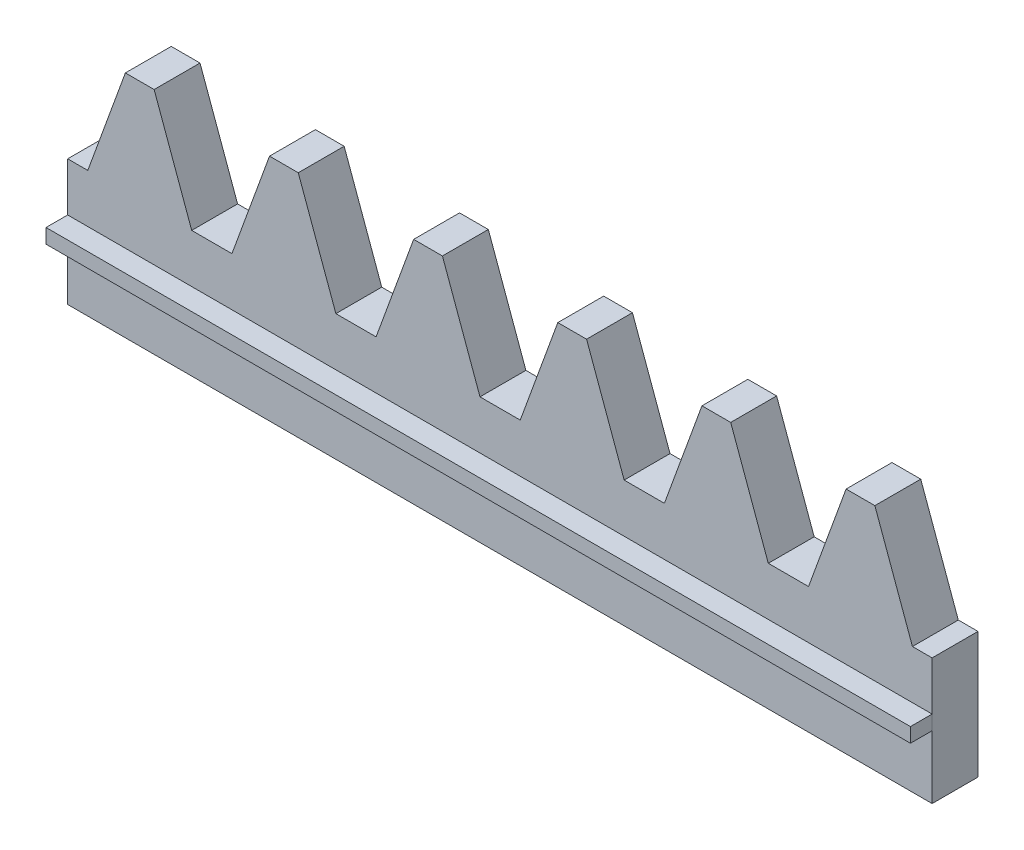
ISO-10303-21;
HEADER;
FILE_DESCRIPTION(('STEP AP214'),'2;1');
FILE_NAME('part.step','',(''),(''),'','','');
FILE_SCHEMA(('AUTOMOTIVE_DESIGN { 1 0 10303 214 1 1 1 1 }'));
ENDSEC;
DATA;
#1=APPLICATION_CONTEXT('core data for automotive mechanical design processes');
#2=APPLICATION_PROTOCOL_DEFINITION('international standard','automotive_design',2000,#1);
#3=PRODUCT_CONTEXT('',#1,'mechanical');
#4=PRODUCT('Part','Part','',(#3));
#5=PRODUCT_RELATED_PRODUCT_CATEGORY('part','',(#4));
#6=PRODUCT_DEFINITION_FORMATION('','',#4);
#7=PRODUCT_DEFINITION_CONTEXT('part definition',#1,'design');
#8=PRODUCT_DEFINITION('design','',#6,#7);
#9=PRODUCT_DEFINITION_SHAPE('','',#8);
#10=(LENGTH_UNIT() NAMED_UNIT(*) SI_UNIT(.MILLI.,.METRE.));
#11=(NAMED_UNIT(*) PLANE_ANGLE_UNIT() SI_UNIT($,.RADIAN.));
#12=(NAMED_UNIT(*) SI_UNIT($,.STERADIAN.) SOLID_ANGLE_UNIT());
#13=UNCERTAINTY_MEASURE_WITH_UNIT(LENGTH_MEASURE(1.E-05),#10,'distance_accuracy_value','');
#14=(GEOMETRIC_REPRESENTATION_CONTEXT(3) GLOBAL_UNCERTAINTY_ASSIGNED_CONTEXT((#13)) GLOBAL_UNIT_ASSIGNED_CONTEXT((#10,
#11,#12)) REPRESENTATION_CONTEXT('',''));
#15=CARTESIAN_POINT('',(0.,0.,0.));
#16=DIRECTION('',(0.,0.,1.));
#17=DIRECTION('',(1.,0.,0.));
#18=AXIS2_PLACEMENT_3D('',#15,#16,#17);
#19=CARTESIAN_POINT('',(-57.3240770108356,19.3978439460535,27.3611781399103));
#20=DIRECTION('',(1.,0.,0.));
#21=DIRECTION('',(0.,0.,-1.));
#22=AXIS2_PLACEMENT_3D('',#19,#20,#21);
#23=PLANE('',#22);
#24=DIRECTION('',(0.,-1.,0.));
#25=VECTOR('',#24,1.);
#26=CARTESIAN_POINT('',(-57.3240770108356,19.3978439460535,24.3611781399103));
#27=LINE('',#26,#25);
#28=CARTESIAN_POINT('',(-57.3240770108356,19.3978439460535,24.3611781399103));
#29=VERTEX_POINT('',#28);
#30=CARTESIAN_POINT('',(-57.3240770108356,17.3978439460535,24.3611781399103));
#31=VERTEX_POINT('',#30);
#32=EDGE_CURVE('E116',#29,#31,#27,.T.);
#33=ORIENTED_EDGE('',*,*,#32,.T.);
#34=DIRECTION('',(0.,0.,-1.));
#35=VECTOR('',#34,1.);
#36=CARTESIAN_POINT('',(-57.3240770108356,17.3978439460535,27.3611781399103));
#37=LINE('',#36,#35);
#38=CARTESIAN_POINT('',(-57.3240770108356,17.3978439460535,27.3611781399103));
#39=VERTEX_POINT('',#38);
#40=EDGE_CURVE('E12',#39,#31,#37,.T.);
#41=ORIENTED_EDGE('',*,*,#40,.F.);
#42=DIRECTION('',(0.,-1.,0.));
#43=VECTOR('',#42,1.);
#44=CARTESIAN_POINT('',(-57.3240770108356,19.3978439460535,27.3611781399103));
#45=LINE('',#44,#43);
#46=CARTESIAN_POINT('',(-57.3240770108356,19.3978439460535,27.3611781399103));
#47=VERTEX_POINT('',#46);
#48=EDGE_CURVE('E104',#47,#39,#45,.T.);
#49=ORIENTED_EDGE('',*,*,#48,.F.);
#50=DIRECTION('',(0.,0.,-1.));
#51=VECTOR('',#50,1.);
#52=CARTESIAN_POINT('',(-57.3240770108356,19.3978439460535,27.3611781399103));
#53=LINE('',#52,#51);
#54=EDGE_CURVE('E112',#47,#29,#53,.T.);
#55=ORIENTED_EDGE('',*,*,#54,.T.);
#56=EDGE_LOOP('',(#33,#41,#49,#55));
#57=FACE_BOUND('',#56,.T.);
#58=ADVANCED_FACE('F53',(#57),#23,.F.);
#59=CARTESIAN_POINT('',(-57.3240770108356,17.3978439460535,27.3611781399103));
#60=DIRECTION('',(0.,1.,0.));
#61=DIRECTION('',(0.,0.,1.));
#62=AXIS2_PLACEMENT_3D('',#59,#60,#61);
#63=PLANE('',#62);
#64=DIRECTION('',(1.,0.,0.));
#65=VECTOR('',#64,1.);
#66=CARTESIAN_POINT('',(-57.3240770108356,17.3978439460535,24.3611781399103));
#67=LINE('',#66,#65);
#68=CARTESIAN_POINT('',(62.3099229891644,17.3978439460535,24.3611781399103));
#69=VERTEX_POINT('',#68);
#70=EDGE_CURVE('E108',#31,#69,#67,.T.);
#71=ORIENTED_EDGE('',*,*,#70,.T.);
#72=DIRECTION('',(0.,0.,-1.));
#73=VECTOR('',#72,1.);
#74=CARTESIAN_POINT('',(62.3099229891644,17.3978439460535,27.3611781399103));
#75=LINE('',#74,#73);
#76=CARTESIAN_POINT('',(62.3099229891644,17.3978439460535,27.3611781399103));
#77=VERTEX_POINT('',#76);
#78=EDGE_CURVE('E61',#77,#69,#75,.T.);
#79=ORIENTED_EDGE('',*,*,#78,.F.);
#80=DIRECTION('',(1.,0.,0.));
#81=VECTOR('',#80,1.);
#82=CARTESIAN_POINT('',(-57.3240770108356,17.3978439460535,27.3611781399103));
#83=LINE('',#82,#81);
#84=EDGE_CURVE('E99',#39,#77,#83,.T.);
#85=ORIENTED_EDGE('',*,*,#84,.F.);
#86=ORIENTED_EDGE('',*,*,#40,.T.);
#87=EDGE_LOOP('',(#71,#79,#85,#86));
#88=FACE_BOUND('',#87,.T.);
#89=ADVANCED_FACE('F107',(#88),#63,.F.);
#90=CARTESIAN_POINT('',(62.3099229891644,19.3978439460535,27.3611781399103));
#91=DIRECTION('',(-1.,0.,0.));
#92=DIRECTION('',(0.,0.,1.));
#93=AXIS2_PLACEMENT_3D('',#90,#91,#92);
#94=PLANE('',#93);
#95=DIRECTION('',(0.,1.,0.));
#96=VECTOR('',#95,1.);
#97=CARTESIAN_POINT('',(62.3099229891644,19.3978439460535,24.3611781399103));
#98=LINE('',#97,#96);
#99=CARTESIAN_POINT('',(62.3099229891644,19.3978439460535,24.3611781399103));
#100=VERTEX_POINT('',#99);
#101=EDGE_CURVE('E86',#69,#100,#98,.T.);
#102=ORIENTED_EDGE('',*,*,#101,.T.);
#103=DIRECTION('',(0.,0.,-1.));
#104=VECTOR('',#103,1.);
#105=CARTESIAN_POINT('',(62.3099229891644,19.3978439460535,27.3611781399103));
#106=LINE('',#105,#104);
#107=CARTESIAN_POINT('',(62.3099229891644,19.3978439460535,27.3611781399103));
#108=VERTEX_POINT('',#107);
#109=EDGE_CURVE('E109',#108,#100,#106,.T.);
#110=ORIENTED_EDGE('',*,*,#109,.F.);
#111=DIRECTION('',(0.,1.,0.));
#112=VECTOR('',#111,1.);
#113=CARTESIAN_POINT('',(62.3099229891644,19.3978439460535,27.3611781399103));
#114=LINE('',#113,#112);
#115=EDGE_CURVE('E102',#77,#108,#114,.T.);
#116=ORIENTED_EDGE('',*,*,#115,.F.);
#117=ORIENTED_EDGE('',*,*,#78,.T.);
#118=EDGE_LOOP('',(#102,#110,#116,#117));
#119=FACE_BOUND('',#118,.T.);
#120=ADVANCED_FACE('F110',(#119),#94,.F.);
#121=CARTESIAN_POINT('',(-57.3240770108356,19.3978439460535,27.3611781399103));
#122=DIRECTION('',(0.,-1.,0.));
#123=DIRECTION('',(0.,0.,-1.));
#124=AXIS2_PLACEMENT_3D('',#121,#122,#123);
#125=PLANE('',#124);
#126=DIRECTION('',(-1.,0.,0.));
#127=VECTOR('',#126,1.);
#128=CARTESIAN_POINT('',(-57.3240770108356,19.3978439460535,24.3611781399103));
#129=LINE('',#128,#127);
#130=EDGE_CURVE('E92',#100,#29,#129,.T.);
#131=ORIENTED_EDGE('',*,*,#130,.T.);
#132=ORIENTED_EDGE('',*,*,#54,.F.);
#133=DIRECTION('',(-1.,0.,0.));
#134=VECTOR('',#133,1.);
#135=CARTESIAN_POINT('',(-57.3240770108356,19.3978439460535,27.3611781399103));
#136=LINE('',#135,#134);
#137=EDGE_CURVE('E69',#108,#47,#136,.T.);
#138=ORIENTED_EDGE('',*,*,#137,.F.);
#139=ORIENTED_EDGE('',*,*,#109,.T.);
#140=EDGE_LOOP('',(#131,#132,#138,#139));
#141=FACE_BOUND('',#140,.T.);
#142=ADVANCED_FACE('F123',(#141),#125,.F.);
#143=CARTESIAN_POINT('',(0.,0.,27.3611781399103));
#144=DIRECTION('',(0.,0.,1.));
#145=DIRECTION('',(1.,0.,0.));
#146=AXIS2_PLACEMENT_3D('',#143,#144,#145);
#147=PLANE('',#146);
#148=ORIENTED_EDGE('',*,*,#48,.T.);
#149=ORIENTED_EDGE('',*,*,#84,.T.);
#150=ORIENTED_EDGE('',*,*,#115,.T.);
#151=ORIENTED_EDGE('',*,*,#137,.T.);
#152=EDGE_LOOP('',(#148,#149,#150,#151));
#153=FACE_BOUND('',#152,.T.);
#154=ADVANCED_FACE('F100',(#153),#147,.T.);
#155=CARTESIAN_POINT('',(0.,0.,24.3611781399103));
#156=DIRECTION('',(0.,0.,1.));
#157=DIRECTION('',(1.,0.,0.));
#158=AXIS2_PLACEMENT_3D('',#155,#156,#157);
#159=PLANE('',#158);
#160=ORIENTED_EDGE('',*,*,#32,.F.);
#161=ORIENTED_EDGE('',*,*,#130,.F.);
#162=ORIENTED_EDGE('',*,*,#101,.F.);
#163=ORIENTED_EDGE('',*,*,#70,.F.);
#164=EDGE_LOOP('',(#160,#161,#162,#163));
#165=FACE_BOUND('',#164,.T.);
#166=ADVANCED_FACE('F126',(#165),#159,.F.);
#167=CLOSED_SHELL('',(#58,#89,#120,#142,#154,#166));
#168=MANIFOLD_SOLID_BREP('B2',#167);
#169=CARTESIAN_POINT('',(-57.3240770108356,40.4165939460293,18.0111781399103));
#170=DIRECTION('',(0.,1.,0.));
#171=DIRECTION('',(0.,0.,1.));
#172=AXIS2_PLACEMENT_3D('',#169,#170,#171);
#173=PLANE('',#172);
#174=DIRECTION('',(0.,0.,1.));
#175=VECTOR('',#174,1.);
#176=CARTESIAN_POINT('',(34.4372003069818,40.4165939460293,18.0111781399103));
#177=LINE('',#176,#175);
#178=CARTESIAN_POINT('',(34.4372003069818,40.4165939460293,18.0111781399103));
#179=VERTEX_POINT('',#178);
#180=CARTESIAN_POINT('',(34.4372003069818,40.4165939460293,24.3611781399103));
#181=VERTEX_POINT('',#180);
#182=EDGE_CURVE('E406',#179,#181,#177,.T.);
#183=ORIENTED_EDGE('',*,*,#182,.F.);
#184=DIRECTION('',(-1.,0.,0.));
#185=VECTOR('',#184,1.);
#186=CARTESIAN_POINT('',(-57.3240770108356,40.4165939460293,18.0111781399103));
#187=LINE('',#186,#185);
#188=CARTESIAN_POINT('',(30.4566656184251,40.4165939460293,18.0111781399103));
#189=VERTEX_POINT('',#188);
#190=EDGE_CURVE('E533',#179,#189,#187,.T.);
#191=ORIENTED_EDGE('',*,*,#190,.T.);
#192=DIRECTION('',(0.,0.,-1.));
#193=VECTOR('',#192,1.);
#194=CARTESIAN_POINT('',(30.4566656184251,40.4165939460293,18.0111781399103));
#195=LINE('',#194,#193);
#196=CARTESIAN_POINT('',(30.4566656184251,40.4165939460293,24.3611781399103));
#197=VERTEX_POINT('',#196);
#198=EDGE_CURVE('E426',#197,#189,#195,.T.);
#199=ORIENTED_EDGE('',*,*,#198,.F.);
#200=DIRECTION('',(-1.,0.,0.));
#201=VECTOR('',#200,1.);
#202=CARTESIAN_POINT('',(-57.3240770108356,40.4165939460293,24.3611781399103));
#203=LINE('',#202,#201);
#204=EDGE_CURVE('E543',#181,#197,#203,.T.);
#205=ORIENTED_EDGE('',*,*,#204,.F.);
#206=EDGE_LOOP('',(#183,#191,#199,#205));
#207=FACE_BOUND('',#206,.T.);
#208=ADVANCED_FACE('F177',(#207),#173,.T.);
#209=DIRECTION('',(0.,0.,1.));
#210=VECTOR('',#209,1.);
#211=CARTESIAN_POINT('',(14.4880869795287,40.4165939460293,18.0111781399103));
#212=LINE('',#211,#210);
#213=CARTESIAN_POINT('',(14.4880869795287,40.4165939460293,18.0111781399103));
#214=VERTEX_POINT('',#213);
#215=CARTESIAN_POINT('',(14.4880869795287,40.4165939460293,24.3611781399103));
#216=VERTEX_POINT('',#215);
#217=EDGE_CURVE('E430',#214,#216,#212,.T.);
#218=ORIENTED_EDGE('',*,*,#217,.F.);
#219=CARTESIAN_POINT('',(10.507552290972,40.4165939460293,18.0111781399103));
#220=VERTEX_POINT('',#219);
#221=EDGE_CURVE('E601',#214,#220,#187,.T.);
#222=ORIENTED_EDGE('',*,*,#221,.T.);
#223=DIRECTION('',(0.,0.,-1.));
#224=VECTOR('',#223,1.);
#225=CARTESIAN_POINT('',(10.507552290972,40.4165939460293,18.0111781399103));
#226=LINE('',#225,#224);
#227=CARTESIAN_POINT('',(10.507552290972,40.4165939460293,24.3611781399103));
#228=VERTEX_POINT('',#227);
#229=EDGE_CURVE('E450',#228,#220,#226,.T.);
#230=ORIENTED_EDGE('',*,*,#229,.F.);
#231=EDGE_CURVE('E574',#216,#228,#203,.T.);
#232=ORIENTED_EDGE('',*,*,#231,.F.);
#233=EDGE_LOOP('',(#218,#222,#230,#232));
#234=FACE_BOUND('',#233,.T.);
#235=ADVANCED_FACE('F619',(#234),#173,.T.);
#236=DIRECTION('',(0.,0.,1.));
#237=VECTOR('',#236,1.);
#238=CARTESIAN_POINT('',(-5.46102634792439,40.4165939460293,18.0111781399103));
#239=LINE('',#238,#237);
#240=CARTESIAN_POINT('',(-5.46102634792439,40.4165939460293,18.0111781399103));
#241=VERTEX_POINT('',#240);
#242=CARTESIAN_POINT('',(-5.46102634792439,40.4165939460293,24.3611781399103));
#243=VERTEX_POINT('',#242);
#244=EDGE_CURVE('E454',#241,#243,#239,.T.);
#245=ORIENTED_EDGE('',*,*,#244,.F.);
#246=CARTESIAN_POINT('',(-9.44156103648114,40.4165939460293,18.0111781399103));
#247=VERTEX_POINT('',#246);
#248=EDGE_CURVE('E596',#241,#247,#187,.T.);
#249=ORIENTED_EDGE('',*,*,#248,.T.);
#250=DIRECTION('',(0.,0.,-1.));
#251=VECTOR('',#250,1.);
#252=CARTESIAN_POINT('',(-9.44156103648114,40.4165939460293,18.0111781399103));
#253=LINE('',#252,#251);
#254=CARTESIAN_POINT('',(-9.44156103648114,40.4165939460293,24.3611781399103));
#255=VERTEX_POINT('',#254);
#256=EDGE_CURVE('E474',#255,#247,#253,.T.);
#257=ORIENTED_EDGE('',*,*,#256,.F.);
#258=EDGE_CURVE('E575',#243,#255,#203,.T.);
#259=ORIENTED_EDGE('',*,*,#258,.F.);
#260=EDGE_LOOP('',(#245,#249,#257,#259));
#261=FACE_BOUND('',#260,.T.);
#262=ADVANCED_FACE('F629',(#261),#173,.T.);
#263=DIRECTION('',(0.,0.,1.));
#264=VECTOR('',#263,1.);
#265=CARTESIAN_POINT('',(-25.4101396753775,40.4165939460293,18.0111781399103));
#266=LINE('',#265,#264);
#267=CARTESIAN_POINT('',(-25.4101396753775,40.4165939460293,18.0111781399103));
#268=VERTEX_POINT('',#267);
#269=CARTESIAN_POINT('',(-25.4101396753775,40.4165939460293,24.3611781399103));
#270=VERTEX_POINT('',#269);
#271=EDGE_CURVE('E478',#268,#270,#266,.T.);
#272=ORIENTED_EDGE('',*,*,#271,.F.);
#273=CARTESIAN_POINT('',(-29.3906743639343,40.4165939460293,18.0111781399103));
#274=VERTEX_POINT('',#273);
#275=EDGE_CURVE('E595',#268,#274,#187,.T.);
#276=ORIENTED_EDGE('',*,*,#275,.T.);
#277=DIRECTION('',(0.,0.,-1.));
#278=VECTOR('',#277,1.);
#279=CARTESIAN_POINT('',(-29.3906743639343,40.4165939460293,18.0111781399103));
#280=LINE('',#279,#278);
#281=CARTESIAN_POINT('',(-29.3906743639343,40.4165939460293,24.3611781399103));
#282=VERTEX_POINT('',#281);
#283=EDGE_CURVE('E498',#282,#274,#280,.T.);
#284=ORIENTED_EDGE('',*,*,#283,.F.);
#285=EDGE_CURVE('E578',#270,#282,#203,.T.);
#286=ORIENTED_EDGE('',*,*,#285,.F.);
#287=EDGE_LOOP('',(#272,#276,#284,#286));
#288=FACE_BOUND('',#287,.T.);
#289=ADVANCED_FACE('F639',(#288),#173,.T.);
#290=DIRECTION('',(0.,0.,1.));
#291=VECTOR('',#290,1.);
#292=CARTESIAN_POINT('',(-45.3592530028306,40.4165939460293,18.0111781399103));
#293=LINE('',#292,#291);
#294=CARTESIAN_POINT('',(-45.3592530028306,40.4165939460293,18.0111781399103));
#295=VERTEX_POINT('',#294);
#296=CARTESIAN_POINT('',(-45.3592530028306,40.4165939460293,24.3611781399103));
#297=VERTEX_POINT('',#296);
#298=EDGE_CURVE('E502',#295,#297,#293,.T.);
#299=ORIENTED_EDGE('',*,*,#298,.F.);
#300=CARTESIAN_POINT('',(-49.3397876913874,40.4165939460293,18.0111781399103));
#301=VERTEX_POINT('',#300);
#302=EDGE_CURVE('E530',#295,#301,#187,.T.);
#303=ORIENTED_EDGE('',*,*,#302,.T.);
#304=DIRECTION('',(0.,0.,-1.));
#305=VECTOR('',#304,1.);
#306=CARTESIAN_POINT('',(-49.3397876913874,40.4165939460293,18.0111781399103));
#307=LINE('',#306,#305);
#308=CARTESIAN_POINT('',(-49.3397876913874,40.4165939460293,24.3611781399103));
#309=VERTEX_POINT('',#308);
#310=EDGE_CURVE('E518',#309,#301,#307,.T.);
#311=ORIENTED_EDGE('',*,*,#310,.F.);
#312=EDGE_CURVE('E541',#297,#309,#203,.T.);
#313=ORIENTED_EDGE('',*,*,#312,.F.);
#314=EDGE_LOOP('',(#299,#303,#311,#313));
#315=FACE_BOUND('',#314,.T.);
#316=ADVANCED_FACE('F593',(#315),#173,.T.);
#317=CARTESIAN_POINT('',(-57.3240770108356,8.66659394604419,18.0111781399103));
#318=DIRECTION('',(-1.,0.,0.));
#319=DIRECTION('',(0.,0.,1.));
#320=AXIS2_PLACEMENT_3D('',#317,#318,#319);
#321=PLANE('',#320);
#322=DIRECTION('',(0.,0.,1.));
#323=VECTOR('',#322,1.);
#324=CARTESIAN_POINT('',(-57.3240770108356,26.1290939460628,18.0111781399103));
#325=LINE('',#324,#323);
#326=CARTESIAN_POINT('',(-57.3240770108356,26.1290939460628,18.0111781399103));
#327=VERTEX_POINT('',#326);
#328=CARTESIAN_POINT('',(-57.3240770108356,26.1290939460628,24.3611781399103));
#329=VERTEX_POINT('',#328);
#330=EDGE_CURVE('E516',#327,#329,#325,.T.);
#331=ORIENTED_EDGE('',*,*,#330,.F.);
#332=DIRECTION('',(0.,-1.,0.));
#333=VECTOR('',#332,1.);
#334=CARTESIAN_POINT('',(-57.3240770108356,8.66659394604419,18.0111781399103));
#335=LINE('',#334,#333);
#336=CARTESIAN_POINT('',(-57.3240770108356,8.66659394604419,18.0111781399103));
#337=VERTEX_POINT('',#336);
#338=EDGE_CURVE('E522',#327,#337,#335,.T.);
#339=ORIENTED_EDGE('',*,*,#338,.T.);
#340=DIRECTION('',(0.,0.,1.));
#341=VECTOR('',#340,1.);
#342=CARTESIAN_POINT('',(-57.3240770108356,8.66659394604419,18.0111781399103));
#343=LINE('',#342,#341);
#344=CARTESIAN_POINT('',(-57.3240770108356,8.66659394604419,24.3611781399103));
#345=VERTEX_POINT('',#344);
#346=EDGE_CURVE('E532',#337,#345,#343,.T.);
#347=ORIENTED_EDGE('',*,*,#346,.T.);
#348=DIRECTION('',(0.,-1.,0.));
#349=VECTOR('',#348,1.);
#350=CARTESIAN_POINT('',(-57.3240770108356,8.66659394604419,24.3611781399103));
#351=LINE('',#350,#349);
#352=EDGE_CURVE('E521',#329,#345,#351,.T.);
#353=ORIENTED_EDGE('',*,*,#352,.F.);
#354=EDGE_LOOP('',(#331,#339,#347,#353));
#355=FACE_BOUND('',#354,.T.);
#356=ADVANCED_FACE('F179',(#355),#321,.T.);
#357=DIRECTION('',(0.,0.,1.));
#358=VECTOR('',#357,1.);
#359=CARTESIAN_POINT('',(54.386313634435,40.4165939460293,18.0111781399103));
#360=LINE('',#359,#358);
#361=CARTESIAN_POINT('',(54.386313634435,40.4165939460293,18.0111781399103));
#362=VERTEX_POINT('',#361);
#363=CARTESIAN_POINT('',(54.386313634435,40.4165939460293,24.3611781399103));
#364=VERTEX_POINT('',#363);
#365=EDGE_CURVE('E385',#362,#364,#360,.T.);
#366=ORIENTED_EDGE('',*,*,#365,.F.);
#367=CARTESIAN_POINT('',(50.4057789458782,40.4165939460293,18.0111781399103));
#368=VERTEX_POINT('',#367);
#369=EDGE_CURVE('E379',#362,#368,#187,.T.);
#370=ORIENTED_EDGE('',*,*,#369,.T.);
#371=DIRECTION('',(0.,0.,-1.));
#372=VECTOR('',#371,1.);
#373=CARTESIAN_POINT('',(50.4057789458782,40.4165939460293,18.0111781399103));
#374=LINE('',#373,#372);
#375=CARTESIAN_POINT('',(50.4057789458782,40.4165939460293,24.3611781399103));
#376=VERTEX_POINT('',#375);
#377=EDGE_CURVE('E402',#376,#368,#374,.T.);
#378=ORIENTED_EDGE('',*,*,#377,.F.);
#379=EDGE_CURVE('E525',#364,#376,#203,.T.);
#380=ORIENTED_EDGE('',*,*,#379,.F.);
#381=EDGE_LOOP('',(#366,#370,#378,#380));
#382=FACE_BOUND('',#381,.T.);
#383=ADVANCED_FACE('F662',(#382),#173,.T.);
#384=CARTESIAN_POINT('',(62.3099229891644,8.66659394604419,18.0111781399103));
#385=DIRECTION('',(1.,0.,0.));
#386=DIRECTION('',(0.,0.,-1.));
#387=AXIS2_PLACEMENT_3D('',#384,#385,#386);
#388=PLANE('',#387);
#389=DIRECTION('',(0.,0.,-1.));
#390=VECTOR('',#389,1.);
#391=CARTESIAN_POINT('',(62.3099229891644,26.1290939460628,18.0111781399103));
#392=LINE('',#391,#390);
#393=CARTESIAN_POINT('',(62.3099229891644,26.1290939460628,24.3611781399103));
#394=VERTEX_POINT('',#393);
#395=CARTESIAN_POINT('',(62.3099229891644,26.1290939460628,18.0111781399103));
#396=VERTEX_POINT('',#395);
#397=EDGE_CURVE('E366',#394,#396,#392,.T.);
#398=ORIENTED_EDGE('',*,*,#397,.F.);
#399=DIRECTION('',(0.,1.,0.));
#400=VECTOR('',#399,1.);
#401=CARTESIAN_POINT('',(62.3099229891644,8.66659394604419,24.3611781399103));
#402=LINE('',#401,#400);
#403=CARTESIAN_POINT('',(62.3099229891644,8.66659394604419,24.3611781399103));
#404=VERTEX_POINT('',#403);
#405=EDGE_CURVE('E538',#404,#394,#402,.T.);
#406=ORIENTED_EDGE('',*,*,#405,.F.);
#407=DIRECTION('',(0.,0.,1.));
#408=VECTOR('',#407,1.);
#409=CARTESIAN_POINT('',(62.3099229891644,8.66659394604419,18.0111781399103));
#410=LINE('',#409,#408);
#411=CARTESIAN_POINT('',(62.3099229891644,8.66659394604419,18.0111781399103));
#412=VERTEX_POINT('',#411);
#413=EDGE_CURVE('E544',#412,#404,#410,.T.);
#414=ORIENTED_EDGE('',*,*,#413,.F.);
#415=DIRECTION('',(0.,1.,0.));
#416=VECTOR('',#415,1.);
#417=CARTESIAN_POINT('',(62.3099229891644,8.66659394604419,18.0111781399103));
#418=LINE('',#417,#416);
#419=EDGE_CURVE('E528',#412,#396,#418,.T.);
#420=ORIENTED_EDGE('',*,*,#419,.T.);
#421=EDGE_LOOP('',(#398,#406,#414,#420));
#422=FACE_BOUND('',#421,.T.);
#423=ADVANCED_FACE('F669',(#422),#388,.T.);
#424=CARTESIAN_POINT('',(-57.3240770108356,8.66659394604419,18.0111781399103));
#425=DIRECTION('',(0.,-1.,0.));
#426=DIRECTION('',(0.,0.,-1.));
#427=AXIS2_PLACEMENT_3D('',#424,#425,#426);
#428=PLANE('',#427);
#429=DIRECTION('',(1.,0.,0.));
#430=VECTOR('',#429,1.);
#431=CARTESIAN_POINT('',(-57.3240770108356,8.66659394604419,24.3611781399103));
#432=LINE('',#431,#430);
#433=EDGE_CURVE('E535',#345,#404,#432,.T.);
#434=ORIENTED_EDGE('',*,*,#433,.F.);
#435=ORIENTED_EDGE('',*,*,#346,.F.);
#436=DIRECTION('',(1.,0.,0.));
#437=VECTOR('',#436,1.);
#438=CARTESIAN_POINT('',(-57.3240770108356,8.66659394604419,18.0111781399103));
#439=LINE('',#438,#437);
#440=EDGE_CURVE('E524',#337,#412,#439,.T.);
#441=ORIENTED_EDGE('',*,*,#440,.T.);
#442=ORIENTED_EDGE('',*,*,#413,.T.);
#443=EDGE_LOOP('',(#434,#435,#441,#442));
#444=FACE_BOUND('',#443,.T.);
#445=ADVANCED_FACE('F675',(#444),#428,.T.);
#446=CARTESIAN_POINT('',(-57.3240770108356,40.4165939460293,18.0111781399103));
#447=DIRECTION('',(0.,0.,-1.));
#448=DIRECTION('',(-1.,0.,0.));
#449=AXIS2_PLACEMENT_3D('',#446,#447,#448);
#450=PLANE('',#449);
#451=DIRECTION('',(0.342020143325663,-0.939692620785911,0.));
#452=VECTOR('',#451,1.);
#453=CARTESIAN_POINT('',(54.3770687904846,40.4419939460293,18.0111781399103));
#454=LINE('',#453,#452);
#455=CARTESIAN_POINT('',(59.586538356501,26.1290939460628,18.0111781399103));
#456=VERTEX_POINT('',#455);
#457=EDGE_CURVE('E363',#362,#456,#454,.T.);
#458=ORIENTED_EDGE('',*,*,#457,.T.);
#459=DIRECTION('',(1.,0.,0.));
#460=VECTOR('',#459,1.);
#461=CARTESIAN_POINT('',(65.1546675512653,26.1290939460628,18.0111781399103));
#462=LINE('',#461,#460);
#463=EDGE_CURVE('E367',#456,#396,#462,.T.);
#464=ORIENTED_EDGE('',*,*,#463,.T.);
#465=ORIENTED_EDGE('',*,*,#419,.F.);
#466=ORIENTED_EDGE('',*,*,#440,.F.);
#467=ORIENTED_EDGE('',*,*,#338,.F.);
#468=DIRECTION('',(1.,0.,0.));
#469=VECTOR('',#468,1.);
#470=CARTESIAN_POINT('',(-54.5400124134534,26.1290939460628,18.0111781399103));
#471=LINE('',#470,#469);
#472=CARTESIAN_POINT('',(-54.5400124134534,26.1290939460628,18.0111781399103));
#473=VERTEX_POINT('',#472);
#474=EDGE_CURVE('E505',#327,#473,#471,.T.);
#475=ORIENTED_EDGE('',*,*,#474,.T.);
#476=DIRECTION('',(0.342020143325663,0.939692620785911,0.));
#477=VECTOR('',#476,1.);
#478=CARTESIAN_POINT('',(-49.330542847437,40.4419939460293,18.0111781399103));
#479=LINE('',#478,#477);
#480=EDGE_CURVE('E508',#473,#301,#479,.T.);
#481=ORIENTED_EDGE('',*,*,#480,.T.);
#482=ORIENTED_EDGE('',*,*,#302,.F.);
#483=DIRECTION('',(0.342020143325663,-0.939692620785911,0.));
#484=VECTOR('',#483,1.);
#485=CARTESIAN_POINT('',(-45.368497846781,40.4419939460293,18.0111781399103));
#486=LINE('',#485,#484);
#487=CARTESIAN_POINT('',(-40.1590282807646,26.1290939460628,18.0111781399103));
#488=VERTEX_POINT('',#487);
#489=EDGE_CURVE('E481',#295,#488,#486,.T.);
#490=ORIENTED_EDGE('',*,*,#489,.T.);
#491=DIRECTION('',(1.,0.,0.));
#492=VECTOR('',#491,1.);
#493=CARTESIAN_POINT('',(-34.5908990860003,26.1290939460628,18.0111781399103));
#494=LINE('',#493,#492);
#495=CARTESIAN_POINT('',(-34.5908990860003,26.1290939460628,18.0111781399103));
#496=VERTEX_POINT('',#495);
#497=EDGE_CURVE('E484',#488,#496,#494,.T.);
#498=ORIENTED_EDGE('',*,*,#497,.T.);
#499=DIRECTION('',(0.342020143325663,0.939692620785911,0.));
#500=VECTOR('',#499,1.);
#501=CARTESIAN_POINT('',(-29.3814295199839,40.4419939460293,18.0111781399103));
#502=LINE('',#501,#500);
#503=EDGE_CURVE('E488',#496,#274,#502,.T.);
#504=ORIENTED_EDGE('',*,*,#503,.T.);
#505=ORIENTED_EDGE('',*,*,#275,.F.);
#506=DIRECTION('',(0.342020143325663,-0.939692620785911,0.));
#507=VECTOR('',#506,1.);
#508=CARTESIAN_POINT('',(-25.4193845193279,40.4419939460293,18.0111781399103));
#509=LINE('',#508,#507);
#510=CARTESIAN_POINT('',(-20.2099149533115,26.1290939460628,18.0111781399103));
#511=VERTEX_POINT('',#510);
#512=EDGE_CURVE('E457',#268,#511,#509,.T.);
#513=ORIENTED_EDGE('',*,*,#512,.T.);
#514=DIRECTION('',(1.,0.,0.));
#515=VECTOR('',#514,1.);
#516=CARTESIAN_POINT('',(-14.6417857585472,26.1290939460628,18.0111781399103));
#517=LINE('',#516,#515);
#518=CARTESIAN_POINT('',(-14.6417857585472,26.1290939460628,18.0111781399103));
#519=VERTEX_POINT('',#518);
#520=EDGE_CURVE('E460',#511,#519,#517,.T.);
#521=ORIENTED_EDGE('',*,*,#520,.T.);
#522=DIRECTION('',(0.342020143325663,0.939692620785911,0.));
#523=VECTOR('',#522,1.);
#524=CARTESIAN_POINT('',(-9.43231619253078,40.4419939460293,18.0111781399103));
#525=LINE('',#524,#523);
#526=EDGE_CURVE('E464',#519,#247,#525,.T.);
#527=ORIENTED_EDGE('',*,*,#526,.T.);
#528=ORIENTED_EDGE('',*,*,#248,.F.);
#529=DIRECTION('',(0.342020143325663,-0.939692620785911,0.));
#530=VECTOR('',#529,1.);
#531=CARTESIAN_POINT('',(-5.47027119187475,40.4419939460293,18.0111781399103));
#532=LINE('',#531,#530);
#533=CARTESIAN_POINT('',(-0.260801625858342,26.1290939460628,18.0111781399103));
#534=VERTEX_POINT('',#533);
#535=EDGE_CURVE('E433',#241,#534,#532,.T.);
#536=ORIENTED_EDGE('',*,*,#535,.T.);
#537=DIRECTION('',(1.,0.,0.));
#538=VECTOR('',#537,1.);
#539=CARTESIAN_POINT('',(5.30732756890594,26.1290939460628,18.0111781399103));
#540=LINE('',#539,#538);
#541=CARTESIAN_POINT('',(5.30732756890594,26.1290939460628,18.0111781399103));
#542=VERTEX_POINT('',#541);
#543=EDGE_CURVE('E436',#534,#542,#540,.T.);
#544=ORIENTED_EDGE('',*,*,#543,.T.);
#545=DIRECTION('',(0.342020143325663,0.939692620785911,0.));
#546=VECTOR('',#545,1.);
#547=CARTESIAN_POINT('',(10.5167971349223,40.4419939460293,18.0111781399103));
#548=LINE('',#547,#546);
#549=EDGE_CURVE('E440',#542,#220,#548,.T.);
#550=ORIENTED_EDGE('',*,*,#549,.T.);
#551=ORIENTED_EDGE('',*,*,#221,.F.);
#552=DIRECTION('',(0.342020143325663,-0.939692620785911,0.));
#553=VECTOR('',#552,1.);
#554=CARTESIAN_POINT('',(14.4788421355784,40.4419939460293,18.0111781399103));
#555=LINE('',#554,#553);
#556=CARTESIAN_POINT('',(19.6883117015948,26.1290939460628,18.0111781399103));
#557=VERTEX_POINT('',#556);
#558=EDGE_CURVE('E409',#214,#557,#555,.T.);
#559=ORIENTED_EDGE('',*,*,#558,.T.);
#560=DIRECTION('',(1.,0.,0.));
#561=VECTOR('',#560,1.);
#562=CARTESIAN_POINT('',(25.256440896359,26.1290939460628,18.0111781399103));
#563=LINE('',#562,#561);
#564=CARTESIAN_POINT('',(25.256440896359,26.1290939460628,18.0111781399103));
#565=VERTEX_POINT('',#564);
#566=EDGE_CURVE('E412',#557,#565,#563,.T.);
#567=ORIENTED_EDGE('',*,*,#566,.T.);
#568=DIRECTION('',(0.342020143325663,0.939692620785911,0.));
#569=VECTOR('',#568,1.);
#570=CARTESIAN_POINT('',(30.4659104623755,40.4419939460293,18.0111781399103));
#571=LINE('',#570,#569);
#572=EDGE_CURVE('E416',#565,#189,#571,.T.);
#573=ORIENTED_EDGE('',*,*,#572,.T.);
#574=ORIENTED_EDGE('',*,*,#190,.F.);
#575=DIRECTION('',(0.342020143325663,-0.939692620785911,0.));
#576=VECTOR('',#575,1.);
#577=CARTESIAN_POINT('',(34.4279554630315,40.4419939460293,18.0111781399103));
#578=LINE('',#577,#576);
#579=CARTESIAN_POINT('',(39.6374250290479,26.1290939460628,18.0111781399103));
#580=VERTEX_POINT('',#579);
#581=EDGE_CURVE('E388',#179,#580,#578,.T.);
#582=ORIENTED_EDGE('',*,*,#581,.T.);
#583=DIRECTION('',(1.,0.,0.));
#584=VECTOR('',#583,1.);
#585=CARTESIAN_POINT('',(45.2055542238122,26.1290939460628,18.0111781399103));
#586=LINE('',#585,#584);
#587=CARTESIAN_POINT('',(45.2055542238122,26.1290939460628,18.0111781399103));
#588=VERTEX_POINT('',#587);
#589=EDGE_CURVE('E391',#580,#588,#586,.T.);
#590=ORIENTED_EDGE('',*,*,#589,.T.);
#591=DIRECTION('',(0.342020143325663,0.939692620785911,0.));
#592=VECTOR('',#591,1.);
#593=CARTESIAN_POINT('',(50.4150237898286,40.4419939460293,18.0111781399103));
#594=LINE('',#593,#592);
#595=EDGE_CURVE('E395',#588,#368,#594,.T.);
#596=ORIENTED_EDGE('',*,*,#595,.T.);
#597=ORIENTED_EDGE('',*,*,#369,.F.);
#598=EDGE_LOOP('',(#458,#464,#465,#466,#467,#475,#481,#482,#490,#498,#504,#505,#513,#521,#527,
#528,#536,#544,#550,#551,#559,#567,#573,#574,#582,#590,#596,#597));
#599=FACE_BOUND('',#598,.T.);
#600=ADVANCED_FACE('F377',(#599),#450,.T.);
#601=CARTESIAN_POINT('',(-57.3240770108356,40.4165939460293,24.3611781399103));
#602=DIRECTION('',(0.,0.,-1.));
#603=DIRECTION('',(-1.,0.,0.));
#604=AXIS2_PLACEMENT_3D('',#601,#602,#603);
#605=PLANE('',#604);
#606=DIRECTION('',(1.,0.,0.));
#607=VECTOR('',#606,1.);
#608=CARTESIAN_POINT('',(65.1546675512653,26.1290939460628,24.3611781399103));
#609=LINE('',#608,#607);
#610=CARTESIAN_POINT('',(59.586538356501,26.1290939460628,24.3611781399103));
#611=VERTEX_POINT('',#610);
#612=EDGE_CURVE('E380',#611,#394,#609,.T.);
#613=ORIENTED_EDGE('',*,*,#612,.F.);
#614=DIRECTION('',(-0.342020143325663,0.939692620785911,0.));
#615=VECTOR('',#614,1.);
#616=CARTESIAN_POINT('',(41.31868030803,76.3196214360402,24.3611781399103));
#617=LINE('',#616,#615);
#618=EDGE_CURVE('E51',#611,#364,#617,.T.);
#619=ORIENTED_EDGE('',*,*,#618,.T.);
#620=ORIENTED_EDGE('',*,*,#379,.T.);
#621=DIRECTION('',(0.342020143325663,0.939692620785911,0.));
#622=VECTOR('',#621,1.);
#623=CARTESIAN_POINT('',(50.4150237898286,40.4419939460293,24.3611781399103));
#624=LINE('',#623,#622);
#625=CARTESIAN_POINT('',(45.2055542238122,26.1290939460628,24.3611781399103));
#626=VERTEX_POINT('',#625);
#627=EDGE_CURVE('E392',#626,#376,#624,.T.);
#628=ORIENTED_EDGE('',*,*,#627,.F.);
#629=DIRECTION('',(1.,0.,0.));
#630=VECTOR('',#629,1.);
#631=CARTESIAN_POINT('',(45.2055542238122,26.1290939460628,24.3611781399103));
#632=LINE('',#631,#630);
#633=CARTESIAN_POINT('',(39.6374250290479,26.1290939460628,24.3611781399103));
#634=VERTEX_POINT('',#633);
#635=EDGE_CURVE('E387',#634,#626,#632,.T.);
#636=ORIENTED_EDGE('',*,*,#635,.F.);
#637=DIRECTION('',(-0.342020143325663,0.939692620785911,0.));
#638=VECTOR('',#637,1.);
#639=CARTESIAN_POINT('',(23.7031699394803,69.9081000004806,24.3611781399103));
#640=LINE('',#639,#638);
#641=EDGE_CURVE('E185',#634,#181,#640,.T.);
#642=ORIENTED_EDGE('',*,*,#641,.T.);
#643=ORIENTED_EDGE('',*,*,#204,.T.);
#644=DIRECTION('',(0.342020143325663,0.939692620785911,0.));
#645=VECTOR('',#644,1.);
#646=CARTESIAN_POINT('',(30.4659104623755,40.4419939460293,24.3611781399103));
#647=LINE('',#646,#645);
#648=CARTESIAN_POINT('',(25.256440896359,26.1290939460628,24.3611781399103));
#649=VERTEX_POINT('',#648);
#650=EDGE_CURVE('E413',#649,#197,#647,.T.);
#651=ORIENTED_EDGE('',*,*,#650,.F.);
#652=DIRECTION('',(1.,0.,0.));
#653=VECTOR('',#652,1.);
#654=CARTESIAN_POINT('',(25.256440896359,26.1290939460628,24.3611781399103));
#655=LINE('',#654,#653);
#656=CARTESIAN_POINT('',(19.6883117015948,26.1290939460628,24.3611781399103));
#657=VERTEX_POINT('',#656);
#658=EDGE_CURVE('E408',#657,#649,#655,.T.);
#659=ORIENTED_EDGE('',*,*,#658,.F.);
#660=DIRECTION('',(-0.342020143325663,0.939692620785911,0.));
#661=VECTOR('',#660,1.);
#662=CARTESIAN_POINT('',(6.08765957093055,63.4965785649209,24.3611781399103));
#663=LINE('',#662,#661);
#664=EDGE_CURVE('E560',#657,#216,#663,.T.);
#665=ORIENTED_EDGE('',*,*,#664,.T.);
#666=ORIENTED_EDGE('',*,*,#231,.T.);
#667=DIRECTION('',(0.342020143325663,0.939692620785911,0.));
#668=VECTOR('',#667,1.);
#669=CARTESIAN_POINT('',(10.5167971349223,40.4419939460293,24.3611781399103));
#670=LINE('',#669,#668);
#671=CARTESIAN_POINT('',(5.30732756890594,26.1290939460628,24.3611781399103));
#672=VERTEX_POINT('',#671);
#673=EDGE_CURVE('E437',#672,#228,#670,.T.);
#674=ORIENTED_EDGE('',*,*,#673,.F.);
#675=DIRECTION('',(1.,0.,0.));
#676=VECTOR('',#675,1.);
#677=CARTESIAN_POINT('',(5.30732756890594,26.1290939460628,24.3611781399103));
#678=LINE('',#677,#676);
#679=CARTESIAN_POINT('',(-0.260801625858342,26.1290939460628,24.3611781399103));
#680=VERTEX_POINT('',#679);
#681=EDGE_CURVE('E432',#680,#672,#678,.T.);
#682=ORIENTED_EDGE('',*,*,#681,.F.);
#683=DIRECTION('',(-0.342020143325663,0.939692620785911,0.));
#684=VECTOR('',#683,1.);
#685=CARTESIAN_POINT('',(-11.5278507976192,57.0850571293613,24.3611781399103));
#686=LINE('',#685,#684);
#687=EDGE_CURVE('E557',#680,#243,#686,.T.);
#688=ORIENTED_EDGE('',*,*,#687,.T.);
#689=ORIENTED_EDGE('',*,*,#258,.T.);
#690=DIRECTION('',(0.342020143325663,0.939692620785911,0.));
#691=VECTOR('',#690,1.);
#692=CARTESIAN_POINT('',(-9.43231619253078,40.4419939460293,24.3611781399103));
#693=LINE('',#692,#691);
#694=CARTESIAN_POINT('',(-14.6417857585472,26.1290939460628,24.3611781399103));
#695=VERTEX_POINT('',#694);
#696=EDGE_CURVE('E461',#695,#255,#693,.T.);
#697=ORIENTED_EDGE('',*,*,#696,.F.);
#698=DIRECTION('',(1.,0.,0.));
#699=VECTOR('',#698,1.);
#700=CARTESIAN_POINT('',(-14.6417857585472,26.1290939460628,24.3611781399103));
#701=LINE('',#700,#699);
#702=CARTESIAN_POINT('',(-20.2099149533115,26.1290939460628,24.3611781399103));
#703=VERTEX_POINT('',#702);
#704=EDGE_CURVE('E456',#703,#695,#701,.T.);
#705=ORIENTED_EDGE('',*,*,#704,.F.);
#706=DIRECTION('',(-0.342020143325663,0.939692620785911,0.));
#707=VECTOR('',#706,1.);
#708=CARTESIAN_POINT('',(-29.1433611661689,50.6735356938016,24.3611781399103));
#709=LINE('',#708,#707);
#710=EDGE_CURVE('E554',#703,#270,#709,.T.);
#711=ORIENTED_EDGE('',*,*,#710,.T.);
#712=ORIENTED_EDGE('',*,*,#285,.T.);
#713=DIRECTION('',(0.342020143325663,0.939692620785911,0.));
#714=VECTOR('',#713,1.);
#715=CARTESIAN_POINT('',(-29.3814295199839,40.4419939460293,24.3611781399103));
#716=LINE('',#715,#714);
#717=CARTESIAN_POINT('',(-34.5908990860003,26.1290939460628,24.3611781399103));
#718=VERTEX_POINT('',#717);
#719=EDGE_CURVE('E485',#718,#282,#716,.T.);
#720=ORIENTED_EDGE('',*,*,#719,.F.);
#721=DIRECTION('',(1.,0.,0.));
#722=VECTOR('',#721,1.);
#723=CARTESIAN_POINT('',(-34.5908990860003,26.1290939460628,24.3611781399103));
#724=LINE('',#723,#722);
#725=CARTESIAN_POINT('',(-40.1590282807646,26.1290939460628,24.3611781399103));
#726=VERTEX_POINT('',#725);
#727=EDGE_CURVE('E480',#726,#718,#724,.T.);
#728=ORIENTED_EDGE('',*,*,#727,.F.);
#729=DIRECTION('',(-0.342020143325663,0.939692620785911,0.));
#730=VECTOR('',#729,1.);
#731=CARTESIAN_POINT('',(-46.7588715347187,44.262014258242,24.3611781399103));
#732=LINE('',#731,#730);
#733=EDGE_CURVE('E551',#726,#297,#732,.T.);
#734=ORIENTED_EDGE('',*,*,#733,.T.);
#735=ORIENTED_EDGE('',*,*,#312,.T.);
#736=DIRECTION('',(0.342020143325663,0.939692620785911,0.));
#737=VECTOR('',#736,1.);
#738=CARTESIAN_POINT('',(-49.330542847437,40.4419939460293,24.3611781399103));
#739=LINE('',#738,#737);
#740=CARTESIAN_POINT('',(-54.5400124134534,26.1290939460628,24.3611781399103));
#741=VERTEX_POINT('',#740);
#742=EDGE_CURVE('E504',#741,#309,#739,.T.);
#743=ORIENTED_EDGE('',*,*,#742,.F.);
#744=DIRECTION('',(-1.,0.,0.));
#745=VECTOR('',#744,1.);
#746=CARTESIAN_POINT('',(-57.3240770108356,26.1290939460628,24.3611781399103));
#747=LINE('',#746,#745);
#748=EDGE_CURVE('E546',#741,#329,#747,.T.);
#749=ORIENTED_EDGE('',*,*,#748,.T.);
#750=ORIENTED_EDGE('',*,*,#352,.T.);
#751=ORIENTED_EDGE('',*,*,#433,.T.);
#752=ORIENTED_EDGE('',*,*,#405,.T.);
#753=EDGE_LOOP('',(#613,#619,#620,#628,#636,#642,#643,#651,#659,#665,#666,#674,#682,#688,#689,
#697,#705,#711,#712,#720,#728,#734,#735,#743,#749,#750,#751,#752));
#754=FACE_BOUND('',#753,.T.);
#755=ADVANCED_FACE('F566',(#754),#605,.F.);
#756=CARTESIAN_POINT('',(-49.330542847437,40.4419939460293,18.0111781399103));
#757=DIRECTION('',(0.93969262078591,-0.342020143325663,0.));
#758=DIRECTION('',(0.342020143325663,0.939692620785911,0.));
#759=AXIS2_PLACEMENT_3D('',#756,#757,#758);
#760=PLANE('',#759);
#761=ORIENTED_EDGE('',*,*,#310,.T.);
#762=ORIENTED_EDGE('',*,*,#480,.F.);
#763=DIRECTION('',(0.,0.,1.));
#764=VECTOR('',#763,1.);
#765=CARTESIAN_POINT('',(-54.5400124134534,26.1290939460628,18.0111781399103));
#766=LINE('',#765,#764);
#767=EDGE_CURVE('E511',#473,#741,#766,.T.);
#768=ORIENTED_EDGE('',*,*,#767,.T.);
#769=ORIENTED_EDGE('',*,*,#742,.T.);
#770=EDGE_LOOP('',(#761,#762,#768,#769));
#771=FACE_BOUND('',#770,.T.);
#772=ADVANCED_FACE('F591',(#771),#760,.F.);
#773=CARTESIAN_POINT('',(-54.5400124134534,26.1290939460628,18.0111781399103));
#774=DIRECTION('',(0.,-1.,0.));
#775=DIRECTION('',(0.,0.,-1.));
#776=AXIS2_PLACEMENT_3D('',#773,#774,#775);
#777=PLANE('',#776);
#778=ORIENTED_EDGE('',*,*,#330,.T.);
#779=ORIENTED_EDGE('',*,*,#748,.F.);
#780=ORIENTED_EDGE('',*,*,#767,.F.);
#781=ORIENTED_EDGE('',*,*,#474,.F.);
#782=EDGE_LOOP('',(#778,#779,#780,#781));
#783=FACE_BOUND('',#782,.T.);
#784=ADVANCED_FACE('F649',(#783),#777,.F.);
#785=CARTESIAN_POINT('',(-45.368497846781,40.4419939460293,18.0111781399103));
#786=DIRECTION('',(-0.93969262078591,-0.342020143325663,0.));
#787=DIRECTION('',(0.342020143325663,-0.939692620785911,0.));
#788=AXIS2_PLACEMENT_3D('',#785,#786,#787);
#789=PLANE('',#788);
#790=ORIENTED_EDGE('',*,*,#298,.T.);
#791=ORIENTED_EDGE('',*,*,#733,.F.);
#792=DIRECTION('',(0.,0.,1.));
#793=VECTOR('',#792,1.);
#794=CARTESIAN_POINT('',(-40.1590282807646,26.1290939460628,18.0111781399103));
#795=LINE('',#794,#793);
#796=EDGE_CURVE('E491',#488,#726,#795,.T.);
#797=ORIENTED_EDGE('',*,*,#796,.F.);
#798=ORIENTED_EDGE('',*,*,#489,.F.);
#799=EDGE_LOOP('',(#790,#791,#797,#798));
#800=FACE_BOUND('',#799,.T.);
#801=ADVANCED_FACE('F647',(#800),#789,.F.);
#802=CARTESIAN_POINT('',(-29.3814295199839,40.4419939460293,18.0111781399103));
#803=DIRECTION('',(0.93969262078591,-0.342020143325663,0.));
#804=DIRECTION('',(0.342020143325663,0.939692620785911,0.));
#805=AXIS2_PLACEMENT_3D('',#802,#803,#804);
#806=PLANE('',#805);
#807=ORIENTED_EDGE('',*,*,#283,.T.);
#808=ORIENTED_EDGE('',*,*,#503,.F.);
#809=DIRECTION('',(0.,0.,1.));
#810=VECTOR('',#809,1.);
#811=CARTESIAN_POINT('',(-34.5908990860003,26.1290939460628,18.0111781399103));
#812=LINE('',#811,#810);
#813=EDGE_CURVE('E496',#496,#718,#812,.T.);
#814=ORIENTED_EDGE('',*,*,#813,.T.);
#815=ORIENTED_EDGE('',*,*,#719,.T.);
#816=EDGE_LOOP('',(#807,#808,#814,#815));
#817=FACE_BOUND('',#816,.T.);
#818=ADVANCED_FACE('F642',(#817),#806,.F.);
#819=CARTESIAN_POINT('',(-34.5908990860003,26.1290939460628,18.0111781399103));
#820=DIRECTION('',(0.,-1.,0.));
#821=DIRECTION('',(0.,0.,-1.));
#822=AXIS2_PLACEMENT_3D('',#819,#820,#821);
#823=PLANE('',#822);
#824=ORIENTED_EDGE('',*,*,#727,.T.);
#825=ORIENTED_EDGE('',*,*,#813,.F.);
#826=ORIENTED_EDGE('',*,*,#497,.F.);
#827=ORIENTED_EDGE('',*,*,#796,.T.);
#828=EDGE_LOOP('',(#824,#825,#826,#827));
#829=FACE_BOUND('',#828,.T.);
#830=ADVANCED_FACE('F645',(#829),#823,.F.);
#831=CARTESIAN_POINT('',(-25.4193845193279,40.4419939460293,18.0111781399103));
#832=DIRECTION('',(-0.93969262078591,-0.342020143325663,0.));
#833=DIRECTION('',(0.342020143325663,-0.939692620785911,0.));
#834=AXIS2_PLACEMENT_3D('',#831,#832,#833);
#835=PLANE('',#834);
#836=ORIENTED_EDGE('',*,*,#271,.T.);
#837=ORIENTED_EDGE('',*,*,#710,.F.);
#838=DIRECTION('',(0.,0.,1.));
#839=VECTOR('',#838,1.);
#840=CARTESIAN_POINT('',(-20.2099149533115,26.1290939460628,18.0111781399103));
#841=LINE('',#840,#839);
#842=EDGE_CURVE('E467',#511,#703,#841,.T.);
#843=ORIENTED_EDGE('',*,*,#842,.F.);
#844=ORIENTED_EDGE('',*,*,#512,.F.);
#845=EDGE_LOOP('',(#836,#837,#843,#844));
#846=FACE_BOUND('',#845,.T.);
#847=ADVANCED_FACE('F723',(#846),#835,.F.);
#848=CARTESIAN_POINT('',(-9.43231619253078,40.4419939460293,18.0111781399103));
#849=DIRECTION('',(0.93969262078591,-0.342020143325663,0.));
#850=DIRECTION('',(0.342020143325663,0.939692620785911,0.));
#851=AXIS2_PLACEMENT_3D('',#848,#849,#850);
#852=PLANE('',#851);
#853=ORIENTED_EDGE('',*,*,#256,.T.);
#854=ORIENTED_EDGE('',*,*,#526,.F.);
#855=DIRECTION('',(0.,0.,1.));
#856=VECTOR('',#855,1.);
#857=CARTESIAN_POINT('',(-14.6417857585472,26.1290939460628,18.0111781399103));
#858=LINE('',#857,#856);
#859=EDGE_CURVE('E472',#519,#695,#858,.T.);
#860=ORIENTED_EDGE('',*,*,#859,.T.);
#861=ORIENTED_EDGE('',*,*,#696,.T.);
#862=EDGE_LOOP('',(#853,#854,#860,#861));
#863=FACE_BOUND('',#862,.T.);
#864=ADVANCED_FACE('F632',(#863),#852,.F.);
#865=CARTESIAN_POINT('',(-14.6417857585472,26.1290939460628,18.0111781399103));
#866=DIRECTION('',(0.,-1.,0.));
#867=DIRECTION('',(0.,0.,-1.));
#868=AXIS2_PLACEMENT_3D('',#865,#866,#867);
#869=PLANE('',#868);
#870=ORIENTED_EDGE('',*,*,#704,.T.);
#871=ORIENTED_EDGE('',*,*,#859,.F.);
#872=ORIENTED_EDGE('',*,*,#520,.F.);
#873=ORIENTED_EDGE('',*,*,#842,.T.);
#874=EDGE_LOOP('',(#870,#871,#872,#873));
#875=FACE_BOUND('',#874,.T.);
#876=ADVANCED_FACE('F635',(#875),#869,.F.);
#877=CARTESIAN_POINT('',(-5.47027119187475,40.4419939460293,18.0111781399103));
#878=DIRECTION('',(-0.93969262078591,-0.342020143325663,0.));
#879=DIRECTION('',(0.342020143325663,-0.939692620785911,0.));
#880=AXIS2_PLACEMENT_3D('',#877,#878,#879);
#881=PLANE('',#880);
#882=ORIENTED_EDGE('',*,*,#244,.T.);
#883=ORIENTED_EDGE('',*,*,#687,.F.);
#884=DIRECTION('',(0.,0.,1.));
#885=VECTOR('',#884,1.);
#886=CARTESIAN_POINT('',(-0.260801625858342,26.1290939460628,18.0111781399103));
#887=LINE('',#886,#885);
#888=EDGE_CURVE('E443',#534,#680,#887,.T.);
#889=ORIENTED_EDGE('',*,*,#888,.F.);
#890=ORIENTED_EDGE('',*,*,#535,.F.);
#891=EDGE_LOOP('',(#882,#883,#889,#890));
#892=FACE_BOUND('',#891,.T.);
#893=ADVANCED_FACE('F747',(#892),#881,.F.);
#894=CARTESIAN_POINT('',(10.5167971349223,40.4419939460293,18.0111781399103));
#895=DIRECTION('',(0.93969262078591,-0.342020143325663,0.));
#896=DIRECTION('',(0.342020143325663,0.939692620785911,0.));
#897=AXIS2_PLACEMENT_3D('',#894,#895,#896);
#898=PLANE('',#897);
#899=ORIENTED_EDGE('',*,*,#229,.T.);
#900=ORIENTED_EDGE('',*,*,#549,.F.);
#901=DIRECTION('',(0.,0.,1.));
#902=VECTOR('',#901,1.);
#903=CARTESIAN_POINT('',(5.30732756890594,26.1290939460628,18.0111781399103));
#904=LINE('',#903,#902);
#905=EDGE_CURVE('E448',#542,#672,#904,.T.);
#906=ORIENTED_EDGE('',*,*,#905,.T.);
#907=ORIENTED_EDGE('',*,*,#673,.T.);
#908=EDGE_LOOP('',(#899,#900,#906,#907));
#909=FACE_BOUND('',#908,.T.);
#910=ADVANCED_FACE('F622',(#909),#898,.F.);
#911=CARTESIAN_POINT('',(5.30732756890594,26.1290939460628,18.0111781399103));
#912=DIRECTION('',(0.,-1.,0.));
#913=DIRECTION('',(0.,0.,-1.));
#914=AXIS2_PLACEMENT_3D('',#911,#912,#913);
#915=PLANE('',#914);
#916=ORIENTED_EDGE('',*,*,#681,.T.);
#917=ORIENTED_EDGE('',*,*,#905,.F.);
#918=ORIENTED_EDGE('',*,*,#543,.F.);
#919=ORIENTED_EDGE('',*,*,#888,.T.);
#920=EDGE_LOOP('',(#916,#917,#918,#919));
#921=FACE_BOUND('',#920,.T.);
#922=ADVANCED_FACE('F625',(#921),#915,.F.);
#923=CARTESIAN_POINT('',(14.4788421355784,40.4419939460293,18.0111781399103));
#924=DIRECTION('',(-0.93969262078591,-0.342020143325663,0.));
#925=DIRECTION('',(0.342020143325663,-0.939692620785911,0.));
#926=AXIS2_PLACEMENT_3D('',#923,#924,#925);
#927=PLANE('',#926);
#928=ORIENTED_EDGE('',*,*,#217,.T.);
#929=ORIENTED_EDGE('',*,*,#664,.F.);
#930=DIRECTION('',(0.,0.,1.));
#931=VECTOR('',#930,1.);
#932=CARTESIAN_POINT('',(19.6883117015948,26.1290939460628,18.0111781399103));
#933=LINE('',#932,#931);
#934=EDGE_CURVE('E419',#557,#657,#933,.T.);
#935=ORIENTED_EDGE('',*,*,#934,.F.);
#936=ORIENTED_EDGE('',*,*,#558,.F.);
#937=EDGE_LOOP('',(#928,#929,#935,#936));
#938=FACE_BOUND('',#937,.T.);
#939=ADVANCED_FACE('F772',(#938),#927,.F.);
#940=CARTESIAN_POINT('',(30.4659104623755,40.4419939460293,18.0111781399103));
#941=DIRECTION('',(0.93969262078591,-0.342020143325663,0.));
#942=DIRECTION('',(0.342020143325663,0.939692620785911,0.));
#943=AXIS2_PLACEMENT_3D('',#940,#941,#942);
#944=PLANE('',#943);
#945=ORIENTED_EDGE('',*,*,#198,.T.);
#946=ORIENTED_EDGE('',*,*,#572,.F.);
#947=DIRECTION('',(0.,0.,1.));
#948=VECTOR('',#947,1.);
#949=CARTESIAN_POINT('',(25.256440896359,26.1290939460628,18.0111781399103));
#950=LINE('',#949,#948);
#951=EDGE_CURVE('E424',#565,#649,#950,.T.);
#952=ORIENTED_EDGE('',*,*,#951,.T.);
#953=ORIENTED_EDGE('',*,*,#650,.T.);
#954=EDGE_LOOP('',(#945,#946,#952,#953));
#955=FACE_BOUND('',#954,.T.);
#956=ADVANCED_FACE('F612',(#955),#944,.F.);
#957=CARTESIAN_POINT('',(25.256440896359,26.1290939460628,18.0111781399103));
#958=DIRECTION('',(0.,-1.,0.));
#959=DIRECTION('',(0.,0.,-1.));
#960=AXIS2_PLACEMENT_3D('',#957,#958,#959);
#961=PLANE('',#960);
#962=ORIENTED_EDGE('',*,*,#658,.T.);
#963=ORIENTED_EDGE('',*,*,#951,.F.);
#964=ORIENTED_EDGE('',*,*,#566,.F.);
#965=ORIENTED_EDGE('',*,*,#934,.T.);
#966=EDGE_LOOP('',(#962,#963,#964,#965));
#967=FACE_BOUND('',#966,.T.);
#968=ADVANCED_FACE('F615',(#967),#961,.F.);
#969=CARTESIAN_POINT('',(34.4279554630315,40.4419939460293,18.0111781399103));
#970=DIRECTION('',(-0.93969262078591,-0.342020143325663,0.));
#971=DIRECTION('',(0.342020143325663,-0.939692620785911,0.));
#972=AXIS2_PLACEMENT_3D('',#969,#970,#971);
#973=PLANE('',#972);
#974=ORIENTED_EDGE('',*,*,#182,.T.);
#975=ORIENTED_EDGE('',*,*,#641,.F.);
#976=DIRECTION('',(0.,0.,1.));
#977=VECTOR('',#976,1.);
#978=CARTESIAN_POINT('',(39.6374250290479,26.1290939460628,18.0111781399103));
#979=LINE('',#978,#977);
#980=EDGE_CURVE('E200',#580,#634,#979,.T.);
#981=ORIENTED_EDGE('',*,*,#980,.F.);
#982=ORIENTED_EDGE('',*,*,#581,.F.);
#983=EDGE_LOOP('',(#974,#975,#981,#982));
#984=FACE_BOUND('',#983,.T.);
#985=ADVANCED_FACE('F797',(#984),#973,.F.);
#986=CARTESIAN_POINT('',(50.4150237898286,40.4419939460293,18.0111781399103));
#987=DIRECTION('',(0.93969262078591,-0.342020143325663,0.));
#988=DIRECTION('',(0.342020143325663,0.939692620785911,0.));
#989=AXIS2_PLACEMENT_3D('',#986,#987,#988);
#990=PLANE('',#989);
#991=ORIENTED_EDGE('',*,*,#377,.T.);
#992=ORIENTED_EDGE('',*,*,#595,.F.);
#993=DIRECTION('',(0.,0.,1.));
#994=VECTOR('',#993,1.);
#995=CARTESIAN_POINT('',(45.2055542238122,26.1290939460628,18.0111781399103));
#996=LINE('',#995,#994);
#997=EDGE_CURVE('E400',#588,#626,#996,.T.);
#998=ORIENTED_EDGE('',*,*,#997,.T.);
#999=ORIENTED_EDGE('',*,*,#627,.T.);
#1000=EDGE_LOOP('',(#991,#992,#998,#999));
#1001=FACE_BOUND('',#1000,.T.);
#1002=ADVANCED_FACE('F806',(#1001),#990,.F.);
#1003=CARTESIAN_POINT('',(45.2055542238122,26.1290939460628,18.0111781399103));
#1004=DIRECTION('',(0.,-1.,0.));
#1005=DIRECTION('',(0.,0.,-1.));
#1006=AXIS2_PLACEMENT_3D('',#1003,#1004,#1005);
#1007=PLANE('',#1006);
#1008=ORIENTED_EDGE('',*,*,#635,.T.);
#1009=ORIENTED_EDGE('',*,*,#997,.F.);
#1010=ORIENTED_EDGE('',*,*,#589,.F.);
#1011=ORIENTED_EDGE('',*,*,#980,.T.);
#1012=EDGE_LOOP('',(#1008,#1009,#1010,#1011));
#1013=FACE_BOUND('',#1012,.T.);
#1014=ADVANCED_FACE('F815',(#1013),#1007,.F.);
#1015=CARTESIAN_POINT('',(54.3770687904846,40.4419939460293,18.0111781399103));
#1016=DIRECTION('',(-0.93969262078591,-0.342020143325663,0.));
#1017=DIRECTION('',(0.342020143325663,-0.939692620785911,0.));
#1018=AXIS2_PLACEMENT_3D('',#1015,#1016,#1017);
#1019=PLANE('',#1018);
#1020=ORIENTED_EDGE('',*,*,#365,.T.);
#1021=ORIENTED_EDGE('',*,*,#618,.F.);
#1022=DIRECTION('',(0.,0.,1.));
#1023=VECTOR('',#1022,1.);
#1024=CARTESIAN_POINT('',(59.586538356501,26.1290939460628,18.0111781399103));
#1025=LINE('',#1024,#1023);
#1026=EDGE_CURVE('E192',#456,#611,#1025,.T.);
#1027=ORIENTED_EDGE('',*,*,#1026,.F.);
#1028=ORIENTED_EDGE('',*,*,#457,.F.);
#1029=EDGE_LOOP('',(#1020,#1021,#1027,#1028));
#1030=FACE_BOUND('',#1029,.T.);
#1031=ADVANCED_FACE('F361',(#1030),#1019,.F.);
#1032=CARTESIAN_POINT('',(65.1546675512653,26.1290939460628,18.0111781399103));
#1033=DIRECTION('',(0.,-1.,0.));
#1034=DIRECTION('',(0.,0.,-1.));
#1035=AXIS2_PLACEMENT_3D('',#1032,#1033,#1034);
#1036=PLANE('',#1035);
#1037=ORIENTED_EDGE('',*,*,#397,.T.);
#1038=ORIENTED_EDGE('',*,*,#463,.F.);
#1039=ORIENTED_EDGE('',*,*,#1026,.T.);
#1040=ORIENTED_EDGE('',*,*,#612,.T.);
#1041=EDGE_LOOP('',(#1037,#1038,#1039,#1040));
#1042=FACE_BOUND('',#1041,.T.);
#1043=ADVANCED_FACE('F370',(#1042),#1036,.F.);
#1044=CLOSED_SHELL('',(#208,#235,#262,#289,#316,#356,#383,#423,#445,#600,#755,#772,#784,#801,
#818,#830,#847,#864,#876,#893,#910,#922,#939,#956,#968,#985,#1002,#1014,#1031,#1043));
#1045=MANIFOLD_SOLID_BREP('B6',#1044);
#1046=ADVANCED_BREP_SHAPE_REPRESENTATION('',(#18,#168,#1045),#14);
#1047=SHAPE_DEFINITION_REPRESENTATION(#9,#1046);
ENDSEC;
END-ISO-10303-21;
